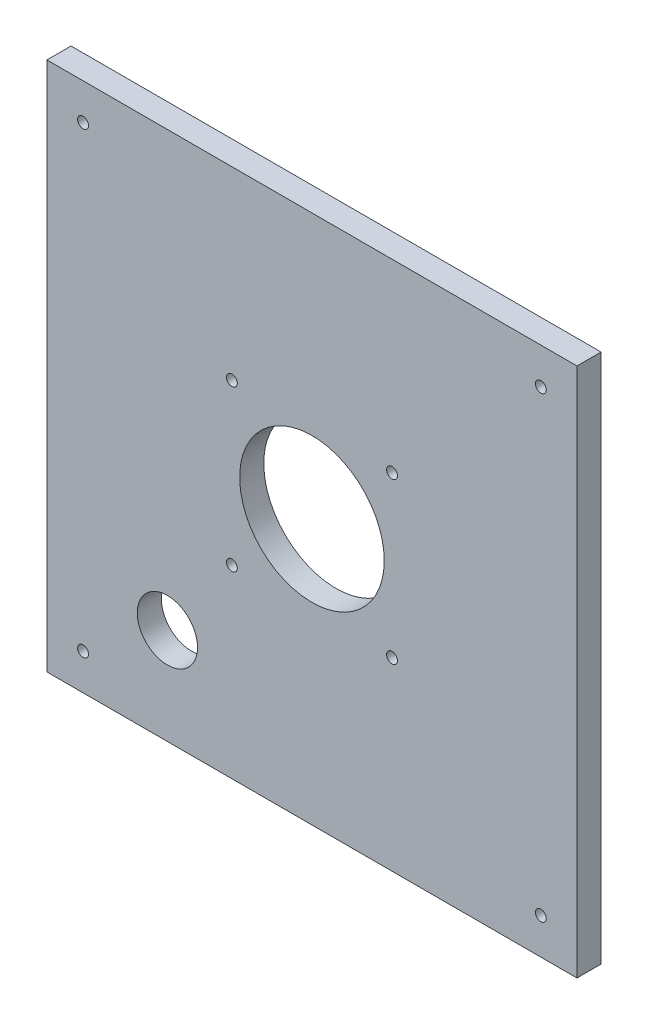
ISO-10303-21;
HEADER;
FILE_DESCRIPTION(('STEP AP214'),'2;1');
FILE_NAME('part.step','',(''),(''),'','','');
FILE_SCHEMA(('AUTOMOTIVE_DESIGN { 1 0 10303 214 1 1 1 1 }'));
ENDSEC;
DATA;
#1=APPLICATION_CONTEXT('core data for automotive mechanical design processes');
#2=APPLICATION_PROTOCOL_DEFINITION('international standard','automotive_design',2000,#1);
#3=PRODUCT_CONTEXT('',#1,'mechanical');
#4=PRODUCT('Part','Part','',(#3));
#5=PRODUCT_RELATED_PRODUCT_CATEGORY('part','',(#4));
#6=PRODUCT_DEFINITION_FORMATION('','',#4);
#7=PRODUCT_DEFINITION_CONTEXT('part definition',#1,'design');
#8=PRODUCT_DEFINITION('design','',#6,#7);
#9=PRODUCT_DEFINITION_SHAPE('','',#8);
#10=(LENGTH_UNIT() NAMED_UNIT(*) SI_UNIT(.MILLI.,.METRE.));
#11=(NAMED_UNIT(*) PLANE_ANGLE_UNIT() SI_UNIT($,.RADIAN.));
#12=(NAMED_UNIT(*) SI_UNIT($,.STERADIAN.) SOLID_ANGLE_UNIT());
#13=UNCERTAINTY_MEASURE_WITH_UNIT(LENGTH_MEASURE(1.E-05),#10,'distance_accuracy_value','');
#14=(GEOMETRIC_REPRESENTATION_CONTEXT(3) GLOBAL_UNCERTAINTY_ASSIGNED_CONTEXT((#13)) GLOBAL_UNIT_ASSIGNED_CONTEXT((#10,
#11,#12)) REPRESENTATION_CONTEXT('',''));
#15=CARTESIAN_POINT('',(0.,0.,0.));
#16=DIRECTION('',(0.,0.,1.));
#17=DIRECTION('',(1.,0.,0.));
#18=AXIS2_PLACEMENT_3D('',#15,#16,#17);
#19=CARTESIAN_POINT('',(110.,-110.,10.));
#20=DIRECTION('',(-1.,0.,0.));
#21=DIRECTION('',(0.,0.,1.));
#22=AXIS2_PLACEMENT_3D('',#19,#20,#21);
#23=PLANE('',#22);
#24=DIRECTION('',(0.,1.,0.));
#25=VECTOR('',#24,1.);
#26=CARTESIAN_POINT('',(110.,-110.,0.));
#27=LINE('',#26,#25);
#28=CARTESIAN_POINT('',(110.,-110.,0.));
#29=VERTEX_POINT('',#28);
#30=CARTESIAN_POINT('',(110.,110.,0.));
#31=VERTEX_POINT('',#30);
#32=EDGE_CURVE('E118',#29,#31,#27,.T.);
#33=ORIENTED_EDGE('',*,*,#32,.T.);
#34=DIRECTION('',(0.,0.,-1.));
#35=VECTOR('',#34,1.);
#36=CARTESIAN_POINT('',(110.,110.,10.));
#37=LINE('',#36,#35);
#38=CARTESIAN_POINT('',(110.,110.,10.));
#39=VERTEX_POINT('',#38);
#40=EDGE_CURVE('E11',#39,#31,#37,.T.);
#41=ORIENTED_EDGE('',*,*,#40,.F.);
#42=DIRECTION('',(0.,1.,0.));
#43=VECTOR('',#42,1.);
#44=CARTESIAN_POINT('',(110.,-110.,10.));
#45=LINE('',#44,#43);
#46=CARTESIAN_POINT('',(110.,-110.,10.));
#47=VERTEX_POINT('',#46);
#48=EDGE_CURVE('E100',#47,#39,#45,.T.);
#49=ORIENTED_EDGE('',*,*,#48,.F.);
#50=DIRECTION('',(0.,0.,-1.));
#51=VECTOR('',#50,1.);
#52=CARTESIAN_POINT('',(110.,-110.,10.));
#53=LINE('',#52,#51);
#54=EDGE_CURVE('E115',#47,#29,#53,.T.);
#55=ORIENTED_EDGE('',*,*,#54,.T.);
#56=EDGE_LOOP('',(#33,#41,#49,#55));
#57=FACE_BOUND('',#56,.T.);
#58=ADVANCED_FACE('F43',(#57),#23,.F.);
#59=CARTESIAN_POINT('',(-110.,110.,10.));
#60=DIRECTION('',(0.,-1.,0.));
#61=DIRECTION('',(0.,0.,-1.));
#62=AXIS2_PLACEMENT_3D('',#59,#60,#61);
#63=PLANE('',#62);
#64=DIRECTION('',(-1.,0.,0.));
#65=VECTOR('',#64,1.);
#66=CARTESIAN_POINT('',(-110.,110.,0.));
#67=LINE('',#66,#65);
#68=CARTESIAN_POINT('',(-110.,110.,0.));
#69=VERTEX_POINT('',#68);
#70=EDGE_CURVE('E105',#31,#69,#67,.T.);
#71=ORIENTED_EDGE('',*,*,#70,.T.);
#72=DIRECTION('',(0.,0.,-1.));
#73=VECTOR('',#72,1.);
#74=CARTESIAN_POINT('',(-110.,110.,10.));
#75=LINE('',#74,#73);
#76=CARTESIAN_POINT('',(-110.,110.,10.));
#77=VERTEX_POINT('',#76);
#78=EDGE_CURVE('E52',#77,#69,#75,.T.);
#79=ORIENTED_EDGE('',*,*,#78,.F.);
#80=DIRECTION('',(-1.,0.,0.));
#81=VECTOR('',#80,1.);
#82=CARTESIAN_POINT('',(-110.,110.,10.));
#83=LINE('',#82,#81);
#84=EDGE_CURVE('E95',#39,#77,#83,.T.);
#85=ORIENTED_EDGE('',*,*,#84,.F.);
#86=ORIENTED_EDGE('',*,*,#40,.T.);
#87=EDGE_LOOP('',(#71,#79,#85,#86));
#88=FACE_BOUND('',#87,.T.);
#89=ADVANCED_FACE('F101',(#88),#63,.F.);
#90=CARTESIAN_POINT('',(-110.,-110.,10.));
#91=DIRECTION('',(1.,0.,0.));
#92=DIRECTION('',(0.,0.,-1.));
#93=AXIS2_PLACEMENT_3D('',#90,#91,#92);
#94=PLANE('',#93);
#95=DIRECTION('',(0.,-1.,0.));
#96=VECTOR('',#95,1.);
#97=CARTESIAN_POINT('',(-110.,-110.,0.));
#98=LINE('',#97,#96);
#99=CARTESIAN_POINT('',(-110.,-110.,0.));
#100=VERTEX_POINT('',#99);
#101=EDGE_CURVE('E79',#69,#100,#98,.T.);
#102=ORIENTED_EDGE('',*,*,#101,.T.);
#103=DIRECTION('',(0.,0.,-1.));
#104=VECTOR('',#103,1.);
#105=CARTESIAN_POINT('',(-110.,-110.,10.));
#106=LINE('',#105,#104);
#107=CARTESIAN_POINT('',(-110.,-110.,10.));
#108=VERTEX_POINT('',#107);
#109=EDGE_CURVE('E102',#108,#100,#106,.T.);
#110=ORIENTED_EDGE('',*,*,#109,.F.);
#111=DIRECTION('',(0.,-1.,0.));
#112=VECTOR('',#111,1.);
#113=CARTESIAN_POINT('',(-110.,-110.,10.));
#114=LINE('',#113,#112);
#115=EDGE_CURVE('E92',#77,#108,#114,.T.);
#116=ORIENTED_EDGE('',*,*,#115,.F.);
#117=ORIENTED_EDGE('',*,*,#78,.T.);
#118=EDGE_LOOP('',(#102,#110,#116,#117));
#119=FACE_BOUND('',#118,.T.);
#120=ADVANCED_FACE('F106',(#119),#94,.F.);
#121=CARTESIAN_POINT('',(-110.,-110.,10.));
#122=DIRECTION('',(0.,1.,0.));
#123=DIRECTION('',(0.,0.,1.));
#124=AXIS2_PLACEMENT_3D('',#121,#122,#123);
#125=PLANE('',#124);
#126=DIRECTION('',(1.,0.,0.));
#127=VECTOR('',#126,1.);
#128=CARTESIAN_POINT('',(-110.,-110.,0.));
#129=LINE('',#128,#127);
#130=EDGE_CURVE('E84',#100,#29,#129,.T.);
#131=ORIENTED_EDGE('',*,*,#130,.T.);
#132=ORIENTED_EDGE('',*,*,#54,.F.);
#133=DIRECTION('',(1.,0.,0.));
#134=VECTOR('',#133,1.);
#135=CARTESIAN_POINT('',(-110.,-110.,10.));
#136=LINE('',#135,#134);
#137=EDGE_CURVE('E65',#108,#47,#136,.T.);
#138=ORIENTED_EDGE('',*,*,#137,.F.);
#139=ORIENTED_EDGE('',*,*,#109,.T.);
#140=EDGE_LOOP('',(#131,#132,#138,#139));
#141=FACE_BOUND('',#140,.T.);
#142=ADVANCED_FACE('F239',(#141),#125,.F.);
#143=CARTESIAN_POINT('',(0.,0.,10.));
#144=DIRECTION('',(0.,0.,-1.));
#145=DIRECTION('',(-1.,0.,0.));
#146=AXIS2_PLACEMENT_3D('',#143,#144,#145);
#147=PLANE('',#146);
#148=CARTESIAN_POINT('',(-60.,-70.,10.));
#149=DIRECTION('',(0.,0.,1.));
#150=DIRECTION('',(1.,0.,0.));
#151=AXIS2_PLACEMENT_3D('',#148,#149,#150);
#152=CIRCLE('',#151,12.5);
#153=CARTESIAN_POINT('',(-47.5,-70.,10.));
#154=VERTEX_POINT('',#153);
#155=EDGE_CURVE('E498',#154,#154,#152,.T.);
#156=ORIENTED_EDGE('',*,*,#155,.F.);
#157=EDGE_LOOP('',(#156));
#158=FACE_BOUND('',#157,.T.);
#159=CARTESIAN_POINT('',(-95.,95.,10.));
#160=DIRECTION('',(0.,0.,1.));
#161=DIRECTION('',(1.,0.,0.));
#162=AXIS2_PLACEMENT_3D('',#159,#160,#161);
#163=CIRCLE('',#162,2.25);
#164=CARTESIAN_POINT('',(-92.75,95.,10.));
#165=VERTEX_POINT('',#164);
#166=EDGE_CURVE('E184',#165,#165,#163,.T.);
#167=ORIENTED_EDGE('',*,*,#166,.F.);
#168=EDGE_LOOP('',(#167));
#169=FACE_BOUND('',#168,.T.);
#170=CARTESIAN_POINT('',(95.,-95.,10.));
#171=DIRECTION('',(0.,0.,1.));
#172=DIRECTION('',(1.,0.,0.));
#173=AXIS2_PLACEMENT_3D('',#170,#171,#172);
#174=CIRCLE('',#173,2.25);
#175=CARTESIAN_POINT('',(97.25,-95.,10.));
#176=VERTEX_POINT('',#175);
#177=EDGE_CURVE('E199',#176,#176,#174,.T.);
#178=ORIENTED_EDGE('',*,*,#177,.F.);
#179=EDGE_LOOP('',(#178));
#180=FACE_BOUND('',#179,.T.);
#181=CARTESIAN_POINT('',(95.,95.,10.));
#182=DIRECTION('',(0.,0.,1.));
#183=DIRECTION('',(1.,0.,0.));
#184=AXIS2_PLACEMENT_3D('',#181,#182,#183);
#185=CIRCLE('',#184,2.25);
#186=CARTESIAN_POINT('',(97.25,95.,10.));
#187=VERTEX_POINT('',#186);
#188=EDGE_CURVE('E502',#187,#187,#185,.T.);
#189=ORIENTED_EDGE('',*,*,#188,.F.);
#190=EDGE_LOOP('',(#189));
#191=FACE_BOUND('',#190,.T.);
#192=CARTESIAN_POINT('',(-95.,-95.,10.));
#193=DIRECTION('',(0.,0.,1.));
#194=DIRECTION('',(1.,0.,0.));
#195=AXIS2_PLACEMENT_3D('',#192,#193,#194);
#196=CIRCLE('',#195,2.25);
#197=CARTESIAN_POINT('',(-92.75,-95.,10.));
#198=VERTEX_POINT('',#197);
#199=EDGE_CURVE('E197',#198,#198,#196,.T.);
#200=ORIENTED_EDGE('',*,*,#199,.F.);
#201=EDGE_LOOP('',(#200));
#202=FACE_BOUND('',#201,.T.);
#203=CARTESIAN_POINT('',(33.2340187157677,-33.2340187157677,10.));
#204=DIRECTION('',(0.,0.,1.));
#205=DIRECTION('',(1.,0.,0.));
#206=AXIS2_PLACEMENT_3D('',#203,#204,#205);
#207=CIRCLE('',#206,2.25);
#208=CARTESIAN_POINT('',(35.4840187157677,-33.2340187157677,10.));
#209=VERTEX_POINT('',#208);
#210=EDGE_CURVE('E148',#209,#209,#207,.T.);
#211=ORIENTED_EDGE('',*,*,#210,.F.);
#212=EDGE_LOOP('',(#211));
#213=FACE_BOUND('',#212,.T.);
#214=CARTESIAN_POINT('',(-33.2340187157677,-33.2340187157677,10.));
#215=DIRECTION('',(0.,0.,1.));
#216=DIRECTION('',(1.,0.,0.));
#217=AXIS2_PLACEMENT_3D('',#214,#215,#216);
#218=CIRCLE('',#217,2.25);
#219=CARTESIAN_POINT('',(-30.9840187157677,-33.2340187157677,10.));
#220=VERTEX_POINT('',#219);
#221=EDGE_CURVE('E155',#220,#220,#218,.T.);
#222=ORIENTED_EDGE('',*,*,#221,.F.);
#223=EDGE_LOOP('',(#222));
#224=FACE_BOUND('',#223,.T.);
#225=CARTESIAN_POINT('',(-33.2340187157677,33.2340187157677,10.));
#226=DIRECTION('',(0.,0.,1.));
#227=DIRECTION('',(1.,0.,0.));
#228=AXIS2_PLACEMENT_3D('',#225,#226,#227);
#229=CIRCLE('',#228,2.25);
#230=CARTESIAN_POINT('',(-30.9840187157677,33.2340187157677,10.));
#231=VERTEX_POINT('',#230);
#232=EDGE_CURVE('E157',#231,#231,#229,.T.);
#233=ORIENTED_EDGE('',*,*,#232,.F.);
#234=EDGE_LOOP('',(#233));
#235=FACE_BOUND('',#234,.T.);
#236=CARTESIAN_POINT('',(33.2340187157677,33.2340187157677,10.));
#237=DIRECTION('',(0.,0.,1.));
#238=DIRECTION('',(1.,0.,0.));
#239=AXIS2_PLACEMENT_3D('',#236,#237,#238);
#240=CIRCLE('',#239,2.25);
#241=CARTESIAN_POINT('',(35.4840187157677,33.2340187157677,10.));
#242=VERTEX_POINT('',#241);
#243=EDGE_CURVE('E162',#242,#242,#240,.T.);
#244=ORIENTED_EDGE('',*,*,#243,.F.);
#245=EDGE_LOOP('',(#244));
#246=FACE_BOUND('',#245,.T.);
#247=CARTESIAN_POINT('',(0.,0.,10.));
#248=DIRECTION('',(0.,0.,1.));
#249=DIRECTION('',(1.,0.,0.));
#250=AXIS2_PLACEMENT_3D('',#247,#248,#249);
#251=CIRCLE('',#250,30.);
#252=CARTESIAN_POINT('',(30.,0.,10.));
#253=VERTEX_POINT('',#252);
#254=EDGE_CURVE('E117',#253,#253,#251,.T.);
#255=ORIENTED_EDGE('',*,*,#254,.F.);
#256=EDGE_LOOP('',(#255));
#257=FACE_BOUND('',#256,.T.);
#258=ORIENTED_EDGE('',*,*,#48,.T.);
#259=ORIENTED_EDGE('',*,*,#84,.T.);
#260=ORIENTED_EDGE('',*,*,#115,.T.);
#261=ORIENTED_EDGE('',*,*,#137,.T.);
#262=EDGE_LOOP('',(#258,#259,#260,#261));
#263=FACE_BOUND('',#262,.T.);
#264=ADVANCED_FACE('F91',(#158,#169,#180,#191,#202,#213,#224,#235,#246,#257,#263),#147,.F.);
#265=CARTESIAN_POINT('',(0.,0.,0.));
#266=DIRECTION('',(0.,0.,-1.));
#267=DIRECTION('',(-1.,0.,0.));
#268=AXIS2_PLACEMENT_3D('',#265,#266,#267);
#269=PLANE('',#268);
#270=CARTESIAN_POINT('',(-60.,-70.,0.));
#271=DIRECTION('',(0.,0.,1.));
#272=DIRECTION('',(1.,0.,0.));
#273=AXIS2_PLACEMENT_3D('',#270,#271,#272);
#274=CIRCLE('',#273,12.5);
#275=CARTESIAN_POINT('',(-47.5,-70.,0.));
#276=VERTEX_POINT('',#275);
#277=EDGE_CURVE('E501',#276,#276,#274,.T.);
#278=ORIENTED_EDGE('',*,*,#277,.T.);
#279=EDGE_LOOP('',(#278));
#280=FACE_BOUND('',#279,.T.);
#281=CARTESIAN_POINT('',(-95.,95.,0.));
#282=DIRECTION('',(0.,0.,1.));
#283=DIRECTION('',(1.,0.,0.));
#284=AXIS2_PLACEMENT_3D('',#281,#282,#283);
#285=CIRCLE('',#284,2.25);
#286=CARTESIAN_POINT('',(-92.75,95.,0.));
#287=VERTEX_POINT('',#286);
#288=EDGE_CURVE('E188',#287,#287,#285,.T.);
#289=ORIENTED_EDGE('',*,*,#288,.T.);
#290=EDGE_LOOP('',(#289));
#291=FACE_BOUND('',#290,.T.);
#292=CARTESIAN_POINT('',(95.,-95.,0.));
#293=DIRECTION('',(0.,0.,1.));
#294=DIRECTION('',(1.,0.,0.));
#295=AXIS2_PLACEMENT_3D('',#292,#293,#294);
#296=CIRCLE('',#295,2.25);
#297=CARTESIAN_POINT('',(97.25,-95.,0.));
#298=VERTEX_POINT('',#297);
#299=EDGE_CURVE('E190',#298,#298,#296,.T.);
#300=ORIENTED_EDGE('',*,*,#299,.T.);
#301=EDGE_LOOP('',(#300));
#302=FACE_BOUND('',#301,.T.);
#303=CARTESIAN_POINT('',(95.,95.,0.));
#304=DIRECTION('',(0.,0.,1.));
#305=DIRECTION('',(1.,0.,0.));
#306=AXIS2_PLACEMENT_3D('',#303,#304,#305);
#307=CIRCLE('',#306,2.25);
#308=CARTESIAN_POINT('',(97.25,95.,0.));
#309=VERTEX_POINT('',#308);
#310=EDGE_CURVE('E206',#309,#309,#307,.T.);
#311=ORIENTED_EDGE('',*,*,#310,.T.);
#312=EDGE_LOOP('',(#311));
#313=FACE_BOUND('',#312,.T.);
#314=CARTESIAN_POINT('',(-95.,-95.,0.));
#315=DIRECTION('',(0.,0.,1.));
#316=DIRECTION('',(1.,0.,0.));
#317=AXIS2_PLACEMENT_3D('',#314,#315,#316);
#318=CIRCLE('',#317,2.25);
#319=CARTESIAN_POINT('',(-92.75,-95.,0.));
#320=VERTEX_POINT('',#319);
#321=EDGE_CURVE('E213',#320,#320,#318,.T.);
#322=ORIENTED_EDGE('',*,*,#321,.T.);
#323=EDGE_LOOP('',(#322));
#324=FACE_BOUND('',#323,.T.);
#325=CARTESIAN_POINT('',(33.2340187157677,-33.2340187157677,0.));
#326=DIRECTION('',(0.,0.,1.));
#327=DIRECTION('',(1.,0.,0.));
#328=AXIS2_PLACEMENT_3D('',#325,#326,#327);
#329=CIRCLE('',#328,4.);
#330=CARTESIAN_POINT('',(37.2340187157677,-33.2340187157677,0.));
#331=VERTEX_POINT('',#330);
#332=EDGE_CURVE('E187',#331,#331,#329,.T.);
#333=ORIENTED_EDGE('',*,*,#332,.T.);
#334=EDGE_LOOP('',(#333));
#335=FACE_BOUND('',#334,.T.);
#336=CARTESIAN_POINT('',(-33.2340187157677,-33.2340187157677,0.));
#337=DIRECTION('',(0.,0.,1.));
#338=DIRECTION('',(1.,0.,0.));
#339=AXIS2_PLACEMENT_3D('',#336,#337,#338);
#340=CIRCLE('',#339,4.);
#341=CARTESIAN_POINT('',(-29.2340187157677,-33.2340187157677,0.));
#342=VERTEX_POINT('',#341);
#343=EDGE_CURVE('E219',#342,#342,#340,.T.);
#344=ORIENTED_EDGE('',*,*,#343,.T.);
#345=EDGE_LOOP('',(#344));
#346=FACE_BOUND('',#345,.T.);
#347=CARTESIAN_POINT('',(-33.2340187157677,33.2340187157677,0.));
#348=DIRECTION('',(0.,0.,1.));
#349=DIRECTION('',(1.,0.,0.));
#350=AXIS2_PLACEMENT_3D('',#347,#348,#349);
#351=CIRCLE('',#350,4.);
#352=CARTESIAN_POINT('',(-29.2340187157677,33.2340187157677,0.));
#353=VERTEX_POINT('',#352);
#354=EDGE_CURVE('E177',#353,#353,#351,.T.);
#355=ORIENTED_EDGE('',*,*,#354,.T.);
#356=EDGE_LOOP('',(#355));
#357=FACE_BOUND('',#356,.T.);
#358=CARTESIAN_POINT('',(33.2340187157677,33.2340187157677,0.));
#359=DIRECTION('',(0.,0.,1.));
#360=DIRECTION('',(1.,0.,0.));
#361=AXIS2_PLACEMENT_3D('',#358,#359,#360);
#362=CIRCLE('',#361,4.);
#363=CARTESIAN_POINT('',(37.2340187157677,33.2340187157677,0.));
#364=VERTEX_POINT('',#363);
#365=EDGE_CURVE('E176',#364,#364,#362,.T.);
#366=ORIENTED_EDGE('',*,*,#365,.T.);
#367=EDGE_LOOP('',(#366));
#368=FACE_BOUND('',#367,.T.);
#369=CARTESIAN_POINT('',(0.,0.,0.));
#370=DIRECTION('',(0.,0.,1.));
#371=DIRECTION('',(1.,0.,0.));
#372=AXIS2_PLACEMENT_3D('',#369,#370,#371);
#373=CIRCLE('',#372,30.);
#374=CARTESIAN_POINT('',(30.,0.,0.));
#375=VERTEX_POINT('',#374);
#376=EDGE_CURVE('E170',#375,#375,#373,.T.);
#377=ORIENTED_EDGE('',*,*,#376,.T.);
#378=EDGE_LOOP('',(#377));
#379=FACE_BOUND('',#378,.T.);
#380=ORIENTED_EDGE('',*,*,#32,.F.);
#381=ORIENTED_EDGE('',*,*,#130,.F.);
#382=ORIENTED_EDGE('',*,*,#101,.F.);
#383=ORIENTED_EDGE('',*,*,#70,.F.);
#384=EDGE_LOOP('',(#380,#381,#382,#383));
#385=FACE_BOUND('',#384,.T.);
#386=ADVANCED_FACE('F236',(#280,#291,#302,#313,#324,#335,#346,#357,#368,#379,#385),#269,.T.);
#387=CARTESIAN_POINT('',(0.,0.,10.));
#388=DIRECTION('',(0.,0.,-1.));
#389=DIRECTION('',(-1.,0.,0.));
#390=AXIS2_PLACEMENT_3D('',#387,#388,#389);
#391=CYLINDRICAL_SURFACE('',#390,30.);
#392=ORIENTED_EDGE('',*,*,#254,.T.);
#393=EDGE_LOOP('',(#392));
#394=FACE_BOUND('',#393,.T.);
#395=ORIENTED_EDGE('',*,*,#376,.F.);
#396=EDGE_LOOP('',(#395));
#397=FACE_BOUND('',#396,.T.);
#398=ADVANCED_FACE('F246',(#394,#397),#391,.F.);
#399=CARTESIAN_POINT('',(33.2340187157677,33.2340187157677,10.));
#400=DIRECTION('',(0.,0.,-1.));
#401=DIRECTION('',(-1.,0.,0.));
#402=AXIS2_PLACEMENT_3D('',#399,#400,#401);
#403=CYLINDRICAL_SURFACE('',#402,2.25);
#404=CARTESIAN_POINT('',(33.2340187157677,33.2340187157677,4.5));
#405=DIRECTION('',(0.,0.,1.));
#406=DIRECTION('',(1.,0.,0.));
#407=AXIS2_PLACEMENT_3D('',#404,#405,#406);
#408=CIRCLE('',#407,2.25);
#409=CARTESIAN_POINT('',(35.4840187157677,33.2340187157677,4.5));
#410=VERTEX_POINT('',#409);
#411=EDGE_CURVE('E46',#410,#410,#408,.T.);
#412=ORIENTED_EDGE('',*,*,#411,.F.);
#413=EDGE_LOOP('',(#412));
#414=FACE_BOUND('',#413,.T.);
#415=ORIENTED_EDGE('',*,*,#243,.T.);
#416=EDGE_LOOP('',(#415));
#417=FACE_BOUND('',#416,.T.);
#418=ADVANCED_FACE('F247',(#414,#417),#403,.F.);
#419=CARTESIAN_POINT('',(-33.2340187157677,33.2340187157677,10.));
#420=DIRECTION('',(0.,0.,-1.));
#421=DIRECTION('',(-1.,0.,0.));
#422=AXIS2_PLACEMENT_3D('',#419,#420,#421);
#423=CYLINDRICAL_SURFACE('',#422,2.25);
#424=CARTESIAN_POINT('',(-33.2340187157677,33.2340187157677,4.5));
#425=DIRECTION('',(0.,0.,1.));
#426=DIRECTION('',(1.,0.,0.));
#427=AXIS2_PLACEMENT_3D('',#424,#425,#426);
#428=CIRCLE('',#427,2.25);
#429=CARTESIAN_POINT('',(-30.9840187157677,33.2340187157677,4.5));
#430=VERTEX_POINT('',#429);
#431=EDGE_CURVE('E138',#430,#430,#428,.T.);
#432=ORIENTED_EDGE('',*,*,#431,.F.);
#433=EDGE_LOOP('',(#432));
#434=FACE_BOUND('',#433,.T.);
#435=ORIENTED_EDGE('',*,*,#232,.T.);
#436=EDGE_LOOP('',(#435));
#437=FACE_BOUND('',#436,.T.);
#438=ADVANCED_FACE('F232',(#434,#437),#423,.F.);
#439=CARTESIAN_POINT('',(-33.2340187157677,-33.2340187157677,10.));
#440=DIRECTION('',(0.,0.,-1.));
#441=DIRECTION('',(-1.,0.,0.));
#442=AXIS2_PLACEMENT_3D('',#439,#440,#441);
#443=CYLINDRICAL_SURFACE('',#442,2.25);
#444=CARTESIAN_POINT('',(-33.2340187157677,-33.2340187157677,4.5));
#445=DIRECTION('',(0.,0.,1.));
#446=DIRECTION('',(1.,0.,0.));
#447=AXIS2_PLACEMENT_3D('',#444,#445,#446);
#448=CIRCLE('',#447,2.25);
#449=CARTESIAN_POINT('',(-30.9840187157677,-33.2340187157677,4.5));
#450=VERTEX_POINT('',#449);
#451=EDGE_CURVE('E134',#450,#450,#448,.T.);
#452=ORIENTED_EDGE('',*,*,#451,.F.);
#453=EDGE_LOOP('',(#452));
#454=FACE_BOUND('',#453,.T.);
#455=ORIENTED_EDGE('',*,*,#221,.T.);
#456=EDGE_LOOP('',(#455));
#457=FACE_BOUND('',#456,.T.);
#458=ADVANCED_FACE('F303',(#454,#457),#443,.F.);
#459=CARTESIAN_POINT('',(33.2340187157677,-33.2340187157677,10.));
#460=DIRECTION('',(0.,0.,-1.));
#461=DIRECTION('',(-1.,0.,0.));
#462=AXIS2_PLACEMENT_3D('',#459,#460,#461);
#463=CYLINDRICAL_SURFACE('',#462,2.25);
#464=CARTESIAN_POINT('',(33.2340187157677,-33.2340187157677,4.5));
#465=DIRECTION('',(0.,0.,1.));
#466=DIRECTION('',(1.,0.,0.));
#467=AXIS2_PLACEMENT_3D('',#464,#465,#466);
#468=CIRCLE('',#467,2.25);
#469=CARTESIAN_POINT('',(35.4840187157677,-33.2340187157677,4.5));
#470=VERTEX_POINT('',#469);
#471=EDGE_CURVE('E128',#470,#470,#468,.T.);
#472=ORIENTED_EDGE('',*,*,#471,.F.);
#473=EDGE_LOOP('',(#472));
#474=FACE_BOUND('',#473,.T.);
#475=ORIENTED_EDGE('',*,*,#210,.T.);
#476=EDGE_LOOP('',(#475));
#477=FACE_BOUND('',#476,.T.);
#478=ADVANCED_FACE('F311',(#474,#477),#463,.F.);
#479=CARTESIAN_POINT('',(33.2340187157677,-33.2340187157677,4.5));
#480=DIRECTION('',(0.,0.,-1.));
#481=DIRECTION('',(-1.,0.,0.));
#482=AXIS2_PLACEMENT_3D('',#479,#480,#481);
#483=CYLINDRICAL_SURFACE('',#482,4.);
#484=CARTESIAN_POINT('',(33.2340187157677,-33.2340187157677,4.5));
#485=DIRECTION('',(0.,0.,1.));
#486=DIRECTION('',(1.,0.,0.));
#487=AXIS2_PLACEMENT_3D('',#484,#485,#486);
#488=CIRCLE('',#487,4.);
#489=CARTESIAN_POINT('',(37.2340187157677,-33.2340187157677,4.5));
#490=VERTEX_POINT('',#489);
#491=EDGE_CURVE('E193',#490,#490,#488,.T.);
#492=ORIENTED_EDGE('',*,*,#491,.T.);
#493=EDGE_LOOP('',(#492));
#494=FACE_BOUND('',#493,.T.);
#495=ORIENTED_EDGE('',*,*,#332,.F.);
#496=EDGE_LOOP('',(#495));
#497=FACE_BOUND('',#496,.T.);
#498=ADVANCED_FACE('F323',(#494,#497),#483,.F.);
#499=CARTESIAN_POINT('',(33.2340187157677,-33.2340187157677,4.5));
#500=DIRECTION('',(0.,0.,1.));
#501=DIRECTION('',(1.,0.,0.));
#502=AXIS2_PLACEMENT_3D('',#499,#500,#501);
#503=PLANE('',#502);
#504=ORIENTED_EDGE('',*,*,#471,.T.);
#505=EDGE_LOOP('',(#504));
#506=FACE_BOUND('',#505,.T.);
#507=ORIENTED_EDGE('',*,*,#491,.F.);
#508=EDGE_LOOP('',(#507));
#509=FACE_BOUND('',#508,.T.);
#510=ADVANCED_FACE('F334',(#506,#509),#503,.F.);
#511=CARTESIAN_POINT('',(-33.2340187157677,-33.2340187157677,4.5));
#512=DIRECTION('',(0.,0.,-1.));
#513=DIRECTION('',(-1.,0.,0.));
#514=AXIS2_PLACEMENT_3D('',#511,#512,#513);
#515=CYLINDRICAL_SURFACE('',#514,4.);
#516=CARTESIAN_POINT('',(-33.2340187157677,-33.2340187157677,4.5));
#517=DIRECTION('',(0.,0.,1.));
#518=DIRECTION('',(1.,0.,0.));
#519=AXIS2_PLACEMENT_3D('',#516,#517,#518);
#520=CIRCLE('',#519,4.);
#521=CARTESIAN_POINT('',(-29.2340187157677,-33.2340187157677,4.5));
#522=VERTEX_POINT('',#521);
#523=EDGE_CURVE('E195',#522,#522,#520,.T.);
#524=ORIENTED_EDGE('',*,*,#523,.T.);
#525=EDGE_LOOP('',(#524));
#526=FACE_BOUND('',#525,.T.);
#527=ORIENTED_EDGE('',*,*,#343,.F.);
#528=EDGE_LOOP('',(#527));
#529=FACE_BOUND('',#528,.T.);
#530=ADVANCED_FACE('F343',(#526,#529),#515,.F.);
#531=CARTESIAN_POINT('',(-33.2340187157677,-33.2340187157677,4.5));
#532=DIRECTION('',(0.,0.,1.));
#533=DIRECTION('',(1.,0.,0.));
#534=AXIS2_PLACEMENT_3D('',#531,#532,#533);
#535=PLANE('',#534);
#536=ORIENTED_EDGE('',*,*,#451,.T.);
#537=EDGE_LOOP('',(#536));
#538=FACE_BOUND('',#537,.T.);
#539=ORIENTED_EDGE('',*,*,#523,.F.);
#540=EDGE_LOOP('',(#539));
#541=FACE_BOUND('',#540,.T.);
#542=ADVANCED_FACE('F351',(#538,#541),#535,.F.);
#543=CARTESIAN_POINT('',(-33.2340187157677,33.2340187157677,4.5));
#544=DIRECTION('',(0.,0.,-1.));
#545=DIRECTION('',(-1.,0.,0.));
#546=AXIS2_PLACEMENT_3D('',#543,#544,#545);
#547=CYLINDRICAL_SURFACE('',#546,4.);
#548=CARTESIAN_POINT('',(-33.2340187157677,33.2340187157677,4.5));
#549=DIRECTION('',(0.,0.,1.));
#550=DIRECTION('',(1.,0.,0.));
#551=AXIS2_PLACEMENT_3D('',#548,#549,#550);
#552=CIRCLE('',#551,4.);
#553=CARTESIAN_POINT('',(-29.2340187157677,33.2340187157677,4.5));
#554=VERTEX_POINT('',#553);
#555=EDGE_CURVE('E185',#554,#554,#552,.T.);
#556=ORIENTED_EDGE('',*,*,#555,.T.);
#557=EDGE_LOOP('',(#556));
#558=FACE_BOUND('',#557,.T.);
#559=ORIENTED_EDGE('',*,*,#354,.F.);
#560=EDGE_LOOP('',(#559));
#561=FACE_BOUND('',#560,.T.);
#562=ADVANCED_FACE('F361',(#558,#561),#547,.F.);
#563=CARTESIAN_POINT('',(-33.2340187157677,33.2340187157677,4.5));
#564=DIRECTION('',(0.,0.,1.));
#565=DIRECTION('',(1.,0.,0.));
#566=AXIS2_PLACEMENT_3D('',#563,#564,#565);
#567=PLANE('',#566);
#568=ORIENTED_EDGE('',*,*,#431,.T.);
#569=EDGE_LOOP('',(#568));
#570=FACE_BOUND('',#569,.T.);
#571=ORIENTED_EDGE('',*,*,#555,.F.);
#572=EDGE_LOOP('',(#571));
#573=FACE_BOUND('',#572,.T.);
#574=ADVANCED_FACE('F373',(#570,#573),#567,.F.);
#575=CARTESIAN_POINT('',(33.2340187157677,33.2340187157677,4.5));
#576=DIRECTION('',(0.,0.,-1.));
#577=DIRECTION('',(-1.,0.,0.));
#578=AXIS2_PLACEMENT_3D('',#575,#576,#577);
#579=CYLINDRICAL_SURFACE('',#578,4.);
#580=CARTESIAN_POINT('',(33.2340187157677,33.2340187157677,4.5));
#581=DIRECTION('',(0.,0.,1.));
#582=DIRECTION('',(1.,0.,0.));
#583=AXIS2_PLACEMENT_3D('',#580,#581,#582);
#584=CIRCLE('',#583,4.);
#585=CARTESIAN_POINT('',(37.2340187157677,33.2340187157677,4.5));
#586=VERTEX_POINT('',#585);
#587=EDGE_CURVE('E132',#586,#586,#584,.T.);
#588=ORIENTED_EDGE('',*,*,#587,.T.);
#589=EDGE_LOOP('',(#588));
#590=FACE_BOUND('',#589,.T.);
#591=ORIENTED_EDGE('',*,*,#365,.F.);
#592=EDGE_LOOP('',(#591));
#593=FACE_BOUND('',#592,.T.);
#594=ADVANCED_FACE('F382',(#590,#593),#579,.F.);
#595=CARTESIAN_POINT('',(33.2340187157677,33.2340187157677,4.5));
#596=DIRECTION('',(0.,0.,1.));
#597=DIRECTION('',(1.,0.,0.));
#598=AXIS2_PLACEMENT_3D('',#595,#596,#597);
#599=PLANE('',#598);
#600=ORIENTED_EDGE('',*,*,#411,.T.);
#601=EDGE_LOOP('',(#600));
#602=FACE_BOUND('',#601,.T.);
#603=ORIENTED_EDGE('',*,*,#587,.F.);
#604=EDGE_LOOP('',(#603));
#605=FACE_BOUND('',#604,.T.);
#606=ADVANCED_FACE('F395',(#602,#605),#599,.F.);
#607=CARTESIAN_POINT('',(-95.,-95.,10.));
#608=DIRECTION('',(0.,0.,-1.));
#609=DIRECTION('',(-1.,0.,0.));
#610=AXIS2_PLACEMENT_3D('',#607,#608,#609);
#611=CYLINDRICAL_SURFACE('',#610,2.25);
#612=ORIENTED_EDGE('',*,*,#199,.T.);
#613=EDGE_LOOP('',(#612));
#614=FACE_BOUND('',#613,.T.);
#615=ORIENTED_EDGE('',*,*,#321,.F.);
#616=EDGE_LOOP('',(#615));
#617=FACE_BOUND('',#616,.T.);
#618=ADVANCED_FACE('F405',(#614,#617),#611,.F.);
#619=CARTESIAN_POINT('',(95.,95.,10.));
#620=DIRECTION('',(0.,0.,-1.));
#621=DIRECTION('',(-1.,0.,0.));
#622=AXIS2_PLACEMENT_3D('',#619,#620,#621);
#623=CYLINDRICAL_SURFACE('',#622,2.25);
#624=ORIENTED_EDGE('',*,*,#188,.T.);
#625=EDGE_LOOP('',(#624));
#626=FACE_BOUND('',#625,.T.);
#627=ORIENTED_EDGE('',*,*,#310,.F.);
#628=EDGE_LOOP('',(#627));
#629=FACE_BOUND('',#628,.T.);
#630=ADVANCED_FACE('F411',(#626,#629),#623,.F.);
#631=CARTESIAN_POINT('',(95.,-95.,10.));
#632=DIRECTION('',(0.,0.,-1.));
#633=DIRECTION('',(-1.,0.,0.));
#634=AXIS2_PLACEMENT_3D('',#631,#632,#633);
#635=CYLINDRICAL_SURFACE('',#634,2.25);
#636=ORIENTED_EDGE('',*,*,#177,.T.);
#637=EDGE_LOOP('',(#636));
#638=FACE_BOUND('',#637,.T.);
#639=ORIENTED_EDGE('',*,*,#299,.F.);
#640=EDGE_LOOP('',(#639));
#641=FACE_BOUND('',#640,.T.);
#642=ADVANCED_FACE('F423',(#638,#641),#635,.F.);
#643=CARTESIAN_POINT('',(-95.,95.,10.));
#644=DIRECTION('',(0.,0.,-1.));
#645=DIRECTION('',(-1.,0.,0.));
#646=AXIS2_PLACEMENT_3D('',#643,#644,#645);
#647=CYLINDRICAL_SURFACE('',#646,2.25);
#648=ORIENTED_EDGE('',*,*,#166,.T.);
#649=EDGE_LOOP('',(#648));
#650=FACE_BOUND('',#649,.T.);
#651=ORIENTED_EDGE('',*,*,#288,.F.);
#652=EDGE_LOOP('',(#651));
#653=FACE_BOUND('',#652,.T.);
#654=ADVANCED_FACE('F431',(#650,#653),#647,.F.);
#655=CARTESIAN_POINT('',(-60.,-70.,10.));
#656=DIRECTION('',(0.,0.,-1.));
#657=DIRECTION('',(-1.,0.,0.));
#658=AXIS2_PLACEMENT_3D('',#655,#656,#657);
#659=CYLINDRICAL_SURFACE('',#658,12.5);
#660=ORIENTED_EDGE('',*,*,#155,.T.);
#661=EDGE_LOOP('',(#660));
#662=FACE_BOUND('',#661,.T.);
#663=ORIENTED_EDGE('',*,*,#277,.F.);
#664=EDGE_LOOP('',(#663));
#665=FACE_BOUND('',#664,.T.);
#666=ADVANCED_FACE('F442',(#662,#665),#659,.F.);
#667=CLOSED_SHELL('',(#58,#89,#120,#142,#264,#386,#398,#418,#438,#458,#478,#498,#510,#530,#542,
#562,#574,#594,#606,#618,#630,#642,#654,#666));
#668=MANIFOLD_SOLID_BREP('B2',#667);
#669=ADVANCED_BREP_SHAPE_REPRESENTATION('',(#18,#668),#14);
#670=SHAPE_DEFINITION_REPRESENTATION(#9,#669);
ENDSEC;
END-ISO-10303-21;
